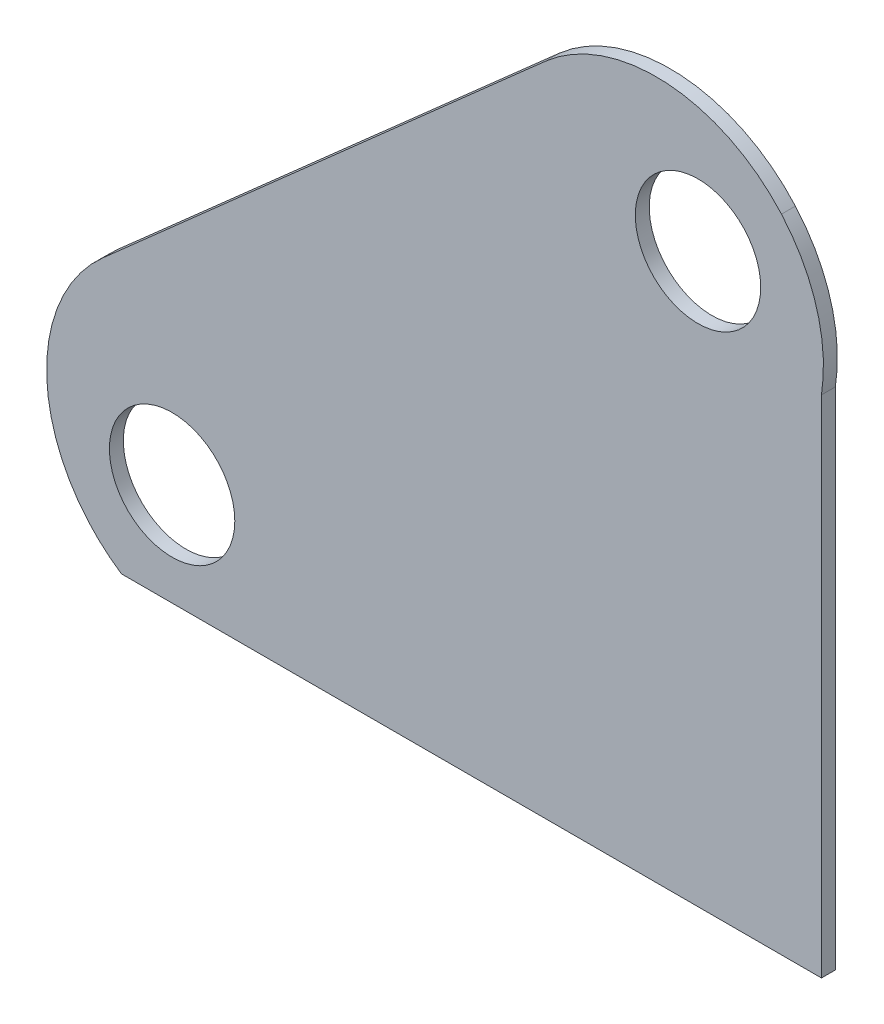
ISO-10303-21;
HEADER;
FILE_DESCRIPTION(('STEP AP214'),'2;1');
FILE_NAME('part.step','',(''),(''),'','','');
FILE_SCHEMA(('AUTOMOTIVE_DESIGN { 1 0 10303 214 1 1 1 1 }'));
ENDSEC;
DATA;
#1=APPLICATION_CONTEXT('core data for automotive mechanical design processes');
#2=APPLICATION_PROTOCOL_DEFINITION('international standard','automotive_design',2000,#1);
#3=PRODUCT_CONTEXT('',#1,'mechanical');
#4=PRODUCT('Part','Part','',(#3));
#5=PRODUCT_RELATED_PRODUCT_CATEGORY('part','',(#4));
#6=PRODUCT_DEFINITION_FORMATION('','',#4);
#7=PRODUCT_DEFINITION_CONTEXT('part definition',#1,'design');
#8=PRODUCT_DEFINITION('design','',#6,#7);
#9=PRODUCT_DEFINITION_SHAPE('','',#8);
#10=(LENGTH_UNIT() NAMED_UNIT(*) SI_UNIT(.MILLI.,.METRE.));
#11=(NAMED_UNIT(*) PLANE_ANGLE_UNIT() SI_UNIT($,.RADIAN.));
#12=(NAMED_UNIT(*) SI_UNIT($,.STERADIAN.) SOLID_ANGLE_UNIT());
#13=UNCERTAINTY_MEASURE_WITH_UNIT(LENGTH_MEASURE(1.E-05),#10,'distance_accuracy_value','');
#14=(GEOMETRIC_REPRESENTATION_CONTEXT(3) GLOBAL_UNCERTAINTY_ASSIGNED_CONTEXT((#13)) GLOBAL_UNIT_ASSIGNED_CONTEXT((#10,
#11,#12)) REPRESENTATION_CONTEXT('',''));
#15=CARTESIAN_POINT('',(0.,0.,0.));
#16=DIRECTION('',(0.,0.,1.));
#17=DIRECTION('',(1.,0.,0.));
#18=AXIS2_PLACEMENT_3D('',#15,#16,#17);
#19=CARTESIAN_POINT('',(-112.51960600071,101.281684884559,3.175));
#20=DIRECTION('',(0.,0.,-1.));
#21=DIRECTION('',(-1.,0.,0.));
#22=AXIS2_PLACEMENT_3D('',#19,#20,#21);
#23=CYLINDRICAL_SURFACE('',#22,14.2875);
#24=CARTESIAN_POINT('',(-112.51960600071,101.281684884559,3.175));
#25=DIRECTION('',(0.,0.,1.));
#26=DIRECTION('',(1.,0.,0.));
#27=AXIS2_PLACEMENT_3D('',#24,#25,#26);
#28=CIRCLE('',#27,14.2875);
#29=CARTESIAN_POINT('',(-98.2321060007097,101.281684884559,3.175));
#30=VERTEX_POINT('',#29);
#31=EDGE_CURVE('E126',#30,#30,#28,.T.);
#32=ORIENTED_EDGE('',*,*,#31,.T.);
#33=EDGE_LOOP('',(#32));
#34=FACE_BOUND('',#33,.T.);
#35=CARTESIAN_POINT('',(-112.51960600071,101.281684884559,0.));
#36=DIRECTION('',(0.,0.,1.));
#37=DIRECTION('',(1.,0.,0.));
#38=AXIS2_PLACEMENT_3D('',#35,#36,#37);
#39=CIRCLE('',#38,14.2875);
#40=CARTESIAN_POINT('',(-98.2321060007097,101.281684884559,0.));
#41=VERTEX_POINT('',#40);
#42=EDGE_CURVE('E136',#41,#41,#39,.T.);
#43=ORIENTED_EDGE('',*,*,#42,.F.);
#44=EDGE_LOOP('',(#43));
#45=FACE_BOUND('',#44,.T.);
#46=ADVANCED_FACE('F33',(#34,#45),#23,.F.);
#47=CARTESIAN_POINT('',(-232.359164859367,-4.74103447805438,3.175));
#48=DIRECTION('',(0.,0.,-1.));
#49=DIRECTION('',(-1.,0.,0.));
#50=AXIS2_PLACEMENT_3D('',#47,#48,#49);
#51=CYLINDRICAL_SURFACE('',#50,14.2875);
#52=CARTESIAN_POINT('',(-232.359164859367,-4.74103447805438,3.175));
#53=DIRECTION('',(0.,0.,1.));
#54=DIRECTION('',(1.,0.,0.));
#55=AXIS2_PLACEMENT_3D('',#52,#53,#54);
#56=CIRCLE('',#55,14.2875);
#57=CARTESIAN_POINT('',(-218.071664859367,-4.74103447805438,3.175));
#58=VERTEX_POINT('',#57);
#59=EDGE_CURVE('E123',#58,#58,#56,.T.);
#60=ORIENTED_EDGE('',*,*,#59,.T.);
#61=EDGE_LOOP('',(#60));
#62=FACE_BOUND('',#61,.T.);
#63=CARTESIAN_POINT('',(-232.359164859367,-4.74103447805438,0.));
#64=DIRECTION('',(0.,0.,1.));
#65=DIRECTION('',(1.,0.,0.));
#66=AXIS2_PLACEMENT_3D('',#63,#64,#65);
#67=CIRCLE('',#66,14.2875);
#68=CARTESIAN_POINT('',(-218.071664859367,-4.74103447805438,0.));
#69=VERTEX_POINT('',#68);
#70=EDGE_CURVE('E133',#69,#69,#67,.T.);
#71=ORIENTED_EDGE('',*,*,#70,.F.);
#72=EDGE_LOOP('',(#71));
#73=FACE_BOUND('',#72,.T.);
#74=ADVANCED_FACE('F188',(#62,#73),#51,.F.);
#75=CARTESIAN_POINT('',(-124.910965273192,141.189313620144,3.175));
#76=DIRECTION('',(0.662611753546831,-0.748963059210262,0.));
#77=DIRECTION('',(0.748963059210262,0.662611753546831,0.));
#78=AXIS2_PLACEMENT_3D('',#75,#76,#77);
#79=PLANE('',#78);
#80=DIRECTION('',(-0.748963059210262,-0.662611753546831,0.));
#81=VECTOR('',#80,1.);
#82=CARTESIAN_POINT('',(-124.910965273192,141.189313620144,0.));
#83=LINE('',#82,#81);
#84=CARTESIAN_POINT('',(-147.276944662814,121.402008170425,0.));
#85=VERTEX_POINT('',#84);
#86=CARTESIAN_POINT('',(-248.092841817531,32.2096273479013,0.));
#87=VERTEX_POINT('',#86);
#88=EDGE_CURVE('E127',#85,#87,#83,.T.);
#89=ORIENTED_EDGE('',*,*,#88,.T.);
#90=DIRECTION('',(0.,0.,-1.));
#91=VECTOR('',#90,1.);
#92=CARTESIAN_POINT('',(-248.092841817531,32.2096273479013,3.175));
#93=LINE('',#92,#91);
#94=CARTESIAN_POINT('',(-248.092841817531,32.2096273479013,3.175));
#95=VERTEX_POINT('',#94);
#96=EDGE_CURVE('E150',#87,#95,#93,.F.);
#97=ORIENTED_EDGE('',*,*,#96,.T.);
#98=DIRECTION('',(-0.748963059210262,-0.662611753546831,0.));
#99=VECTOR('',#98,1.);
#100=CARTESIAN_POINT('',(-124.910965273192,141.189313620144,3.175));
#101=LINE('',#100,#99);
#102=CARTESIAN_POINT('',(-147.276944662814,121.402008170425,3.175));
#103=VERTEX_POINT('',#102);
#104=EDGE_CURVE('E130',#103,#95,#101,.T.);
#105=ORIENTED_EDGE('',*,*,#104,.F.);
#106=DIRECTION('',(0.,0.,-1.));
#107=VECTOR('',#106,1.);
#108=CARTESIAN_POINT('',(-147.276944662814,121.402008170425,0.));
#109=LINE('',#108,#107);
#110=EDGE_CURVE('E148',#103,#85,#109,.T.);
#111=ORIENTED_EDGE('',*,*,#110,.T.);
#112=EDGE_LOOP('',(#89,#97,#105,#111));
#113=FACE_BOUND('',#112,.T.);
#114=ADVANCED_FACE('F171',(#113),#79,.F.);
#115=CARTESIAN_POINT('',(0.,0.,3.175));
#116=DIRECTION('',(0.,0.,1.));
#117=DIRECTION('',(1.,0.,0.));
#118=AXIS2_PLACEMENT_3D('',#115,#116,#117);
#119=PLANE('',#118);
#120=DIRECTION('',(-1.,0.,0.));
#121=VECTOR('',#120,1.);
#122=CARTESIAN_POINT('',(-243.907901426154,-28.0758652080098,3.175));
#123=LINE('',#122,#121);
#124=CARTESIAN_POINT('',(-84.3867063874739,-28.0758652080098,3.175));
#125=VERTEX_POINT('',#124);
#126=CARTESIAN_POINT('',(-243.907901426154,-28.0758652080098,3.175));
#127=VERTEX_POINT('',#126);
#128=EDGE_CURVE('E103',#125,#127,#123,.T.);
#129=ORIENTED_EDGE('',*,*,#128,.F.);
#130=DIRECTION('',(0.,1.,0.));
#131=VECTOR('',#130,1.);
#132=CARTESIAN_POINT('',(-84.3867063874739,0.,3.175));
#133=LINE('',#132,#131);
#134=CARTESIAN_POINT('',(-84.3867063874739,86.9941848845585,3.175));
#135=VERTEX_POINT('',#134);
#136=EDGE_CURVE('E109',#125,#135,#133,.T.);
#137=ORIENTED_EDGE('',*,*,#136,.T.);
#138=CARTESIAN_POINT('',(-122.03143685268,92.8665156145138,3.175));
#139=DIRECTION('',(0.,0.,1.));
#140=DIRECTION('',(1.,0.,0.));
#141=AXIS2_PLACEMENT_3D('',#138,#139,#140);
#142=CIRCLE('',#141,38.1);
#143=CARTESIAN_POINT('',(-93.4959442967691,118.112023424648,3.175));
#144=VERTEX_POINT('',#143);
#145=EDGE_CURVE('E50',#135,#144,#142,.T.);
#146=ORIENTED_EDGE('',*,*,#145,.T.);
#147=CARTESIAN_POINT('',(-122.03143685268,92.8665156145138,3.175));
#148=DIRECTION('',(0.,0.,1.));
#149=DIRECTION('',(1.,0.,0.));
#150=AXIS2_PLACEMENT_3D('',#147,#148,#149);
#151=CIRCLE('',#150,38.1);
#152=EDGE_CURVE('E153',#144,#103,#151,.T.);
#153=ORIENTED_EDGE('',*,*,#152,.T.);
#154=ORIENTED_EDGE('',*,*,#104,.T.);
#155=CARTESIAN_POINT('',(-222.847334007397,3.67413479199029,3.175));
#156=DIRECTION('',(0.,0.,1.));
#157=DIRECTION('',(1.,0.,0.));
#158=AXIS2_PLACEMENT_3D('',#155,#156,#157);
#159=CIRCLE('',#158,38.1);
#160=CARTESIAN_POINT('',(-251.382826563308,-21.5713730181441,3.175));
#161=VERTEX_POINT('',#160);
#162=EDGE_CURVE('E11',#95,#161,#159,.T.);
#163=ORIENTED_EDGE('',*,*,#162,.T.);
#164=CARTESIAN_POINT('',(-222.847334007397,3.67413479199016,3.175));
#165=DIRECTION('',(0.,0.,1.));
#166=DIRECTION('',(1.,0.,0.));
#167=AXIS2_PLACEMENT_3D('',#164,#165,#166);
#168=CIRCLE('',#167,38.1);
#169=EDGE_CURVE('E42',#161,#127,#168,.T.);
#170=ORIENTED_EDGE('',*,*,#169,.T.);
#171=EDGE_LOOP('',(#129,#137,#146,#153,#154,#163,#170));
#172=FACE_BOUND('',#171,.T.);
#173=ORIENTED_EDGE('',*,*,#59,.F.);
#174=EDGE_LOOP('',(#173));
#175=FACE_BOUND('',#174,.T.);
#176=ORIENTED_EDGE('',*,*,#31,.F.);
#177=EDGE_LOOP('',(#176));
#178=FACE_BOUND('',#177,.T.);
#179=ADVANCED_FACE('F168',(#172,#175,#178),#119,.T.);
#180=CARTESIAN_POINT('',(0.,0.,0.));
#181=DIRECTION('',(0.,0.,1.));
#182=DIRECTION('',(1.,0.,0.));
#183=AXIS2_PLACEMENT_3D('',#180,#181,#182);
#184=PLANE('',#183);
#185=DIRECTION('',(0.,1.,0.));
#186=VECTOR('',#185,1.);
#187=CARTESIAN_POINT('',(-84.3867063874739,0.,0.));
#188=LINE('',#187,#186);
#189=CARTESIAN_POINT('',(-84.3867063874739,-28.0758652080098,0.));
#190=VERTEX_POINT('',#189);
#191=CARTESIAN_POINT('',(-84.3867063874739,86.9941848845585,0.));
#192=VERTEX_POINT('',#191);
#193=EDGE_CURVE('E107',#190,#192,#188,.T.);
#194=ORIENTED_EDGE('',*,*,#193,.F.);
#195=DIRECTION('',(-1.,0.,0.));
#196=VECTOR('',#195,1.);
#197=CARTESIAN_POINT('',(-243.907901426154,-28.0758652080098,0.));
#198=LINE('',#197,#196);
#199=CARTESIAN_POINT('',(-243.907901426154,-28.0758652080098,0.));
#200=VERTEX_POINT('',#199);
#201=EDGE_CURVE('E93',#190,#200,#198,.T.);
#202=ORIENTED_EDGE('',*,*,#201,.T.);
#203=CARTESIAN_POINT('',(-222.847334007397,3.67413479199016,0.));
#204=DIRECTION('',(0.,0.,1.));
#205=DIRECTION('',(1.,0.,0.));
#206=AXIS2_PLACEMENT_3D('',#203,#204,#205);
#207=CIRCLE('',#206,38.1);
#208=CARTESIAN_POINT('',(-251.382826563308,-21.5713730181441,0.));
#209=VERTEX_POINT('',#208);
#210=EDGE_CURVE('E144',#200,#209,#207,.F.);
#211=ORIENTED_EDGE('',*,*,#210,.T.);
#212=CARTESIAN_POINT('',(-222.847334007397,3.67413479199029,0.));
#213=DIRECTION('',(0.,0.,1.));
#214=DIRECTION('',(1.,0.,0.));
#215=AXIS2_PLACEMENT_3D('',#212,#213,#214);
#216=CIRCLE('',#215,38.1);
#217=EDGE_CURVE('E146',#209,#87,#216,.F.);
#218=ORIENTED_EDGE('',*,*,#217,.T.);
#219=ORIENTED_EDGE('',*,*,#88,.F.);
#220=CARTESIAN_POINT('',(-122.03143685268,92.8665156145138,0.));
#221=DIRECTION('',(0.,0.,1.));
#222=DIRECTION('',(1.,0.,0.));
#223=AXIS2_PLACEMENT_3D('',#220,#221,#222);
#224=CIRCLE('',#223,38.1);
#225=CARTESIAN_POINT('',(-93.4959442967691,118.112023424648,0.));
#226=VERTEX_POINT('',#225);
#227=EDGE_CURVE('E132',#85,#226,#224,.F.);
#228=ORIENTED_EDGE('',*,*,#227,.T.);
#229=CARTESIAN_POINT('',(-122.03143685268,92.8665156145138,0.));
#230=DIRECTION('',(0.,0.,1.));
#231=DIRECTION('',(1.,0.,0.));
#232=AXIS2_PLACEMENT_3D('',#229,#230,#231);
#233=CIRCLE('',#232,38.1);
#234=EDGE_CURVE('E116',#226,#192,#233,.F.);
#235=ORIENTED_EDGE('',*,*,#234,.T.);
#236=EDGE_LOOP('',(#194,#202,#211,#218,#219,#228,#235));
#237=FACE_BOUND('',#236,.T.);
#238=ORIENTED_EDGE('',*,*,#70,.T.);
#239=EDGE_LOOP('',(#238));
#240=FACE_BOUND('',#239,.T.);
#241=ORIENTED_EDGE('',*,*,#42,.T.);
#242=EDGE_LOOP('',(#241));
#243=FACE_BOUND('',#242,.T.);
#244=ADVANCED_FACE('F113',(#237,#240,#243),#184,.F.);
#245=CARTESIAN_POINT('',(-222.847334007397,3.67413479199016,3.175));
#246=DIRECTION('',(0.,0.,1.));
#247=DIRECTION('',(1.,0.,0.));
#248=AXIS2_PLACEMENT_3D('',#245,#246,#247);
#249=CYLINDRICAL_SURFACE('',#248,38.1);
#250=DIRECTION('',(0.,0.,1.));
#251=VECTOR('',#250,1.);
#252=CARTESIAN_POINT('',(-243.907901426154,-28.0758652080098,0.));
#253=LINE('',#252,#251);
#254=EDGE_CURVE('E99',#200,#127,#253,.T.);
#255=ORIENTED_EDGE('',*,*,#254,.T.);
#256=ORIENTED_EDGE('',*,*,#169,.F.);
#257=DIRECTION('',(0.,0.,-1.));
#258=VECTOR('',#257,1.);
#259=CARTESIAN_POINT('',(-251.382826563308,-21.5713730181441,3.175));
#260=LINE('',#259,#258);
#261=EDGE_CURVE('E137',#209,#161,#260,.F.);
#262=ORIENTED_EDGE('',*,*,#261,.F.);
#263=ORIENTED_EDGE('',*,*,#210,.F.);
#264=EDGE_LOOP('',(#255,#256,#262,#263));
#265=FACE_BOUND('',#264,.T.);
#266=ADVANCED_FACE('F176',(#265),#249,.T.);
#267=CARTESIAN_POINT('',(-222.847334007397,3.67413479199029,3.175));
#268=DIRECTION('',(0.,0.,-1.));
#269=DIRECTION('',(-1.,0.,0.));
#270=AXIS2_PLACEMENT_3D('',#267,#268,#269);
#271=CYLINDRICAL_SURFACE('',#270,38.1);
#272=ORIENTED_EDGE('',*,*,#162,.F.);
#273=ORIENTED_EDGE('',*,*,#96,.F.);
#274=ORIENTED_EDGE('',*,*,#217,.F.);
#275=ORIENTED_EDGE('',*,*,#261,.T.);
#276=EDGE_LOOP('',(#272,#273,#274,#275));
#277=FACE_BOUND('',#276,.T.);
#278=ADVANCED_FACE('F174',(#277),#271,.T.);
#279=CARTESIAN_POINT('',(-122.03143685268,92.8665156145138,3.175));
#280=DIRECTION('',(0.,0.,1.));
#281=DIRECTION('',(1.,0.,0.));
#282=AXIS2_PLACEMENT_3D('',#279,#280,#281);
#283=CYLINDRICAL_SURFACE('',#282,38.1);
#284=ORIENTED_EDGE('',*,*,#110,.F.);
#285=ORIENTED_EDGE('',*,*,#152,.F.);
#286=DIRECTION('',(0.,0.,-1.));
#287=VECTOR('',#286,1.);
#288=CARTESIAN_POINT('',(-93.4959442967691,118.112023424648,3.175));
#289=LINE('',#288,#287);
#290=EDGE_CURVE('E37',#226,#144,#289,.F.);
#291=ORIENTED_EDGE('',*,*,#290,.F.);
#292=ORIENTED_EDGE('',*,*,#227,.F.);
#293=EDGE_LOOP('',(#284,#285,#291,#292));
#294=FACE_BOUND('',#293,.T.);
#295=ADVANCED_FACE('F35',(#294),#283,.T.);
#296=CARTESIAN_POINT('',(-122.03143685268,92.8665156145138,3.175));
#297=DIRECTION('',(0.,0.,-1.));
#298=DIRECTION('',(-1.,0.,0.));
#299=AXIS2_PLACEMENT_3D('',#296,#297,#298);
#300=CYLINDRICAL_SURFACE('',#299,38.1);
#301=DIRECTION('',(0.,0.,1.));
#302=VECTOR('',#301,1.);
#303=CARTESIAN_POINT('',(-84.3867063874739,86.9941848845585,0.));
#304=LINE('',#303,#302);
#305=EDGE_CURVE('E110',#192,#135,#304,.T.);
#306=ORIENTED_EDGE('',*,*,#305,.F.);
#307=ORIENTED_EDGE('',*,*,#234,.F.);
#308=ORIENTED_EDGE('',*,*,#290,.T.);
#309=ORIENTED_EDGE('',*,*,#145,.F.);
#310=EDGE_LOOP('',(#306,#307,#308,#309));
#311=FACE_BOUND('',#310,.T.);
#312=ADVANCED_FACE('F163',(#311),#300,.T.);
#313=CARTESIAN_POINT('',(-243.907901426154,-28.0758652080098,0.));
#314=DIRECTION('',(0.,1.,0.));
#315=DIRECTION('',(0.,0.,1.));
#316=AXIS2_PLACEMENT_3D('',#313,#314,#315);
#317=PLANE('',#316);
#318=ORIENTED_EDGE('',*,*,#201,.F.);
#319=DIRECTION('',(0.,0.,1.));
#320=VECTOR('',#319,1.);
#321=CARTESIAN_POINT('',(-84.3867063874739,-28.0758652080098,0.));
#322=LINE('',#321,#320);
#323=EDGE_CURVE('E96',#190,#125,#322,.T.);
#324=ORIENTED_EDGE('',*,*,#323,.T.);
#325=ORIENTED_EDGE('',*,*,#128,.T.);
#326=ORIENTED_EDGE('',*,*,#254,.F.);
#327=EDGE_LOOP('',(#318,#324,#325,#326));
#328=FACE_BOUND('',#327,.T.);
#329=ADVANCED_FACE('F95',(#328),#317,.F.);
#330=CARTESIAN_POINT('',(-84.3867063874739,0.,0.));
#331=DIRECTION('',(1.,0.,0.));
#332=DIRECTION('',(0.,0.,-1.));
#333=AXIS2_PLACEMENT_3D('',#330,#331,#332);
#334=PLANE('',#333);
#335=ORIENTED_EDGE('',*,*,#136,.F.);
#336=ORIENTED_EDGE('',*,*,#323,.F.);
#337=ORIENTED_EDGE('',*,*,#193,.T.);
#338=ORIENTED_EDGE('',*,*,#305,.T.);
#339=EDGE_LOOP('',(#335,#336,#337,#338));
#340=FACE_BOUND('',#339,.T.);
#341=ADVANCED_FACE('F106',(#340),#334,.T.);
#342=CLOSED_SHELL('',(#46,#74,#114,#179,#244,#266,#278,#295,#312,#329,#341));
#343=MANIFOLD_SOLID_BREP('B2',#342);
#344=ADVANCED_BREP_SHAPE_REPRESENTATION('',(#18,#343),#14);
#345=SHAPE_DEFINITION_REPRESENTATION(#9,#344);
ENDSEC;
END-ISO-10303-21;
